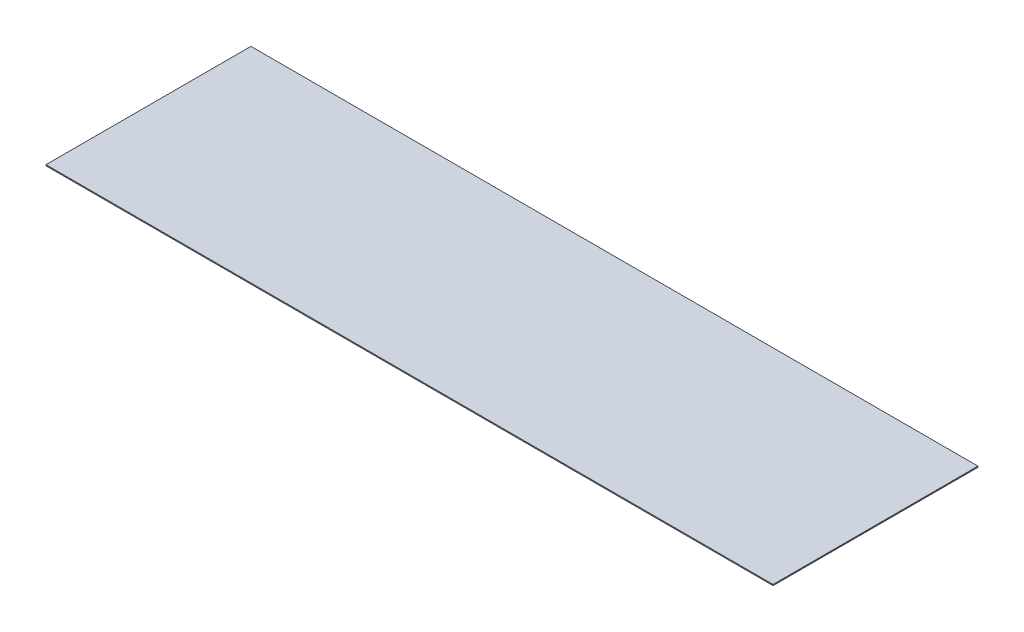
ISO-10303-21;
HEADER;
FILE_DESCRIPTION(('STEP AP214'),'2;1');
FILE_NAME('part.step','',(''),(''),'','','');
FILE_SCHEMA(('AUTOMOTIVE_DESIGN { 1 0 10303 214 1 1 1 1 }'));
ENDSEC;
DATA;
#1=APPLICATION_CONTEXT('core data for automotive mechanical design processes');
#2=APPLICATION_PROTOCOL_DEFINITION('international standard','automotive_design',2000,#1);
#3=PRODUCT_CONTEXT('',#1,'mechanical');
#4=PRODUCT('Part','Part','',(#3));
#5=PRODUCT_RELATED_PRODUCT_CATEGORY('part','',(#4));
#6=PRODUCT_DEFINITION_FORMATION('','',#4);
#7=PRODUCT_DEFINITION_CONTEXT('part definition',#1,'design');
#8=PRODUCT_DEFINITION('design','',#6,#7);
#9=PRODUCT_DEFINITION_SHAPE('','',#8);
#10=(LENGTH_UNIT() NAMED_UNIT(*) SI_UNIT(.MILLI.,.METRE.));
#11=(NAMED_UNIT(*) PLANE_ANGLE_UNIT() SI_UNIT($,.RADIAN.));
#12=(NAMED_UNIT(*) SI_UNIT($,.STERADIAN.) SOLID_ANGLE_UNIT());
#13=UNCERTAINTY_MEASURE_WITH_UNIT(LENGTH_MEASURE(1.E-05),#10,'distance_accuracy_value','');
#14=(GEOMETRIC_REPRESENTATION_CONTEXT(3) GLOBAL_UNCERTAINTY_ASSIGNED_CONTEXT((#13)) GLOBAL_UNIT_ASSIGNED_CONTEXT((#10,
#11,#12)) REPRESENTATION_CONTEXT('',''));
#15=CARTESIAN_POINT('',(0.,0.,0.));
#16=DIRECTION('',(0.,0.,1.));
#17=DIRECTION('',(1.,0.,0.));
#18=AXIS2_PLACEMENT_3D('',#15,#16,#17);
#19=CARTESIAN_POINT('',(0.,1.5875,0.));
#20=DIRECTION('',(1.,0.,0.));
#21=DIRECTION('',(0.,0.,-1.));
#22=AXIS2_PLACEMENT_3D('',#19,#20,#21);
#23=PLANE('',#22);
#24=DIRECTION('',(0.,0.,1.));
#25=VECTOR('',#24,1.);
#26=CARTESIAN_POINT('',(0.,0.,0.));
#27=LINE('',#26,#25);
#28=CARTESIAN_POINT('',(0.,0.,-310.));
#29=VERTEX_POINT('',#28);
#30=CARTESIAN_POINT('',(0.,0.,0.));
#31=VERTEX_POINT('',#30);
#32=EDGE_CURVE('E101',#29,#31,#27,.T.);
#33=ORIENTED_EDGE('',*,*,#32,.T.);
#34=DIRECTION('',(0.,-1.,0.));
#35=VECTOR('',#34,1.);
#36=CARTESIAN_POINT('',(0.,1.5875,0.));
#37=LINE('',#36,#35);
#38=CARTESIAN_POINT('',(0.,1.5875,0.));
#39=VERTEX_POINT('',#38);
#40=EDGE_CURVE('E11',#39,#31,#37,.T.);
#41=ORIENTED_EDGE('',*,*,#40,.F.);
#42=DIRECTION('',(0.,0.,1.));
#43=VECTOR('',#42,1.);
#44=CARTESIAN_POINT('',(0.,1.5875,0.));
#45=LINE('',#44,#43);
#46=CARTESIAN_POINT('',(0.,1.5875,-310.));
#47=VERTEX_POINT('',#46);
#48=EDGE_CURVE('E89',#47,#39,#45,.T.);
#49=ORIENTED_EDGE('',*,*,#48,.F.);
#50=DIRECTION('',(0.,-1.,0.));
#51=VECTOR('',#50,1.);
#52=CARTESIAN_POINT('',(0.,1.5875,-310.));
#53=LINE('',#52,#51);
#54=EDGE_CURVE('E97',#47,#29,#53,.T.);
#55=ORIENTED_EDGE('',*,*,#54,.T.);
#56=EDGE_LOOP('',(#33,#41,#49,#55));
#57=FACE_BOUND('',#56,.T.);
#58=ADVANCED_FACE('F38',(#57),#23,.F.);
#59=CARTESIAN_POINT('',(0.,1.5875,0.));
#60=DIRECTION('',(0.,0.,-1.));
#61=DIRECTION('',(-1.,0.,0.));
#62=AXIS2_PLACEMENT_3D('',#59,#60,#61);
#63=PLANE('',#62);
#64=DIRECTION('',(1.,0.,0.));
#65=VECTOR('',#64,1.);
#66=CARTESIAN_POINT('',(0.,0.,0.));
#67=LINE('',#66,#65);
#68=CARTESIAN_POINT('',(1100.,0.,0.));
#69=VERTEX_POINT('',#68);
#70=EDGE_CURVE('E93',#31,#69,#67,.T.);
#71=ORIENTED_EDGE('',*,*,#70,.T.);
#72=DIRECTION('',(0.,-1.,0.));
#73=VECTOR('',#72,1.);
#74=CARTESIAN_POINT('',(1100.,1.5875,0.));
#75=LINE('',#74,#73);
#76=CARTESIAN_POINT('',(1100.,1.5875,0.));
#77=VERTEX_POINT('',#76);
#78=EDGE_CURVE('E46',#77,#69,#75,.T.);
#79=ORIENTED_EDGE('',*,*,#78,.F.);
#80=DIRECTION('',(1.,0.,0.));
#81=VECTOR('',#80,1.);
#82=CARTESIAN_POINT('',(0.,1.5875,0.));
#83=LINE('',#82,#81);
#84=EDGE_CURVE('E84',#39,#77,#83,.T.);
#85=ORIENTED_EDGE('',*,*,#84,.F.);
#86=ORIENTED_EDGE('',*,*,#40,.T.);
#87=EDGE_LOOP('',(#71,#79,#85,#86));
#88=FACE_BOUND('',#87,.T.);
#89=ADVANCED_FACE('F92',(#88),#63,.F.);
#90=CARTESIAN_POINT('',(1100.,1.5875,0.));
#91=DIRECTION('',(-1.,0.,0.));
#92=DIRECTION('',(0.,0.,1.));
#93=AXIS2_PLACEMENT_3D('',#90,#91,#92);
#94=PLANE('',#93);
#95=DIRECTION('',(0.,0.,-1.));
#96=VECTOR('',#95,1.);
#97=CARTESIAN_POINT('',(1100.,0.,0.));
#98=LINE('',#97,#96);
#99=CARTESIAN_POINT('',(1100.,0.,-310.));
#100=VERTEX_POINT('',#99);
#101=EDGE_CURVE('E71',#69,#100,#98,.T.);
#102=ORIENTED_EDGE('',*,*,#101,.T.);
#103=DIRECTION('',(0.,-1.,0.));
#104=VECTOR('',#103,1.);
#105=CARTESIAN_POINT('',(1100.,1.5875,-310.));
#106=LINE('',#105,#104);
#107=CARTESIAN_POINT('',(1100.,1.5875,-310.));
#108=VERTEX_POINT('',#107);
#109=EDGE_CURVE('E94',#108,#100,#106,.T.);
#110=ORIENTED_EDGE('',*,*,#109,.F.);
#111=DIRECTION('',(0.,0.,-1.));
#112=VECTOR('',#111,1.);
#113=CARTESIAN_POINT('',(1100.,1.5875,0.));
#114=LINE('',#113,#112);
#115=EDGE_CURVE('E87',#77,#108,#114,.T.);
#116=ORIENTED_EDGE('',*,*,#115,.F.);
#117=ORIENTED_EDGE('',*,*,#78,.T.);
#118=EDGE_LOOP('',(#102,#110,#116,#117));
#119=FACE_BOUND('',#118,.T.);
#120=ADVANCED_FACE('F95',(#119),#94,.F.);
#121=CARTESIAN_POINT('',(0.,1.5875,-310.));
#122=DIRECTION('',(0.,0.,1.));
#123=DIRECTION('',(1.,0.,0.));
#124=AXIS2_PLACEMENT_3D('',#121,#122,#123);
#125=PLANE('',#124);
#126=DIRECTION('',(-1.,0.,0.));
#127=VECTOR('',#126,1.);
#128=CARTESIAN_POINT('',(0.,0.,-310.));
#129=LINE('',#128,#127);
#130=EDGE_CURVE('E77',#100,#29,#129,.T.);
#131=ORIENTED_EDGE('',*,*,#130,.T.);
#132=ORIENTED_EDGE('',*,*,#54,.F.);
#133=DIRECTION('',(-1.,0.,0.));
#134=VECTOR('',#133,1.);
#135=CARTESIAN_POINT('',(0.,1.5875,-310.));
#136=LINE('',#135,#134);
#137=EDGE_CURVE('E54',#108,#47,#136,.T.);
#138=ORIENTED_EDGE('',*,*,#137,.F.);
#139=ORIENTED_EDGE('',*,*,#109,.T.);
#140=EDGE_LOOP('',(#131,#132,#138,#139));
#141=FACE_BOUND('',#140,.T.);
#142=ADVANCED_FACE('F108',(#141),#125,.F.);
#143=CARTESIAN_POINT('',(0.,1.5875,0.));
#144=DIRECTION('',(0.,-1.,0.));
#145=DIRECTION('',(0.,0.,-1.));
#146=AXIS2_PLACEMENT_3D('',#143,#144,#145);
#147=PLANE('',#146);
#148=ORIENTED_EDGE('',*,*,#48,.T.);
#149=ORIENTED_EDGE('',*,*,#84,.T.);
#150=ORIENTED_EDGE('',*,*,#115,.T.);
#151=ORIENTED_EDGE('',*,*,#137,.T.);
#152=EDGE_LOOP('',(#148,#149,#150,#151));
#153=FACE_BOUND('',#152,.T.);
#154=ADVANCED_FACE('F85',(#153),#147,.F.);
#155=CARTESIAN_POINT('',(0.,0.,0.));
#156=DIRECTION('',(0.,-1.,0.));
#157=DIRECTION('',(0.,0.,-1.));
#158=AXIS2_PLACEMENT_3D('',#155,#156,#157);
#159=PLANE('',#158);
#160=ORIENTED_EDGE('',*,*,#32,.F.);
#161=ORIENTED_EDGE('',*,*,#130,.F.);
#162=ORIENTED_EDGE('',*,*,#101,.F.);
#163=ORIENTED_EDGE('',*,*,#70,.F.);
#164=EDGE_LOOP('',(#160,#161,#162,#163));
#165=FACE_BOUND('',#164,.T.);
#166=ADVANCED_FACE('F111',(#165),#159,.T.);
#167=CLOSED_SHELL('',(#58,#89,#120,#142,#154,#166));
#168=MANIFOLD_SOLID_BREP('B2',#167);
#169=ADVANCED_BREP_SHAPE_REPRESENTATION('',(#18,#168),#14);
#170=SHAPE_DEFINITION_REPRESENTATION(#9,#169);
ENDSEC;
END-ISO-10303-21;
